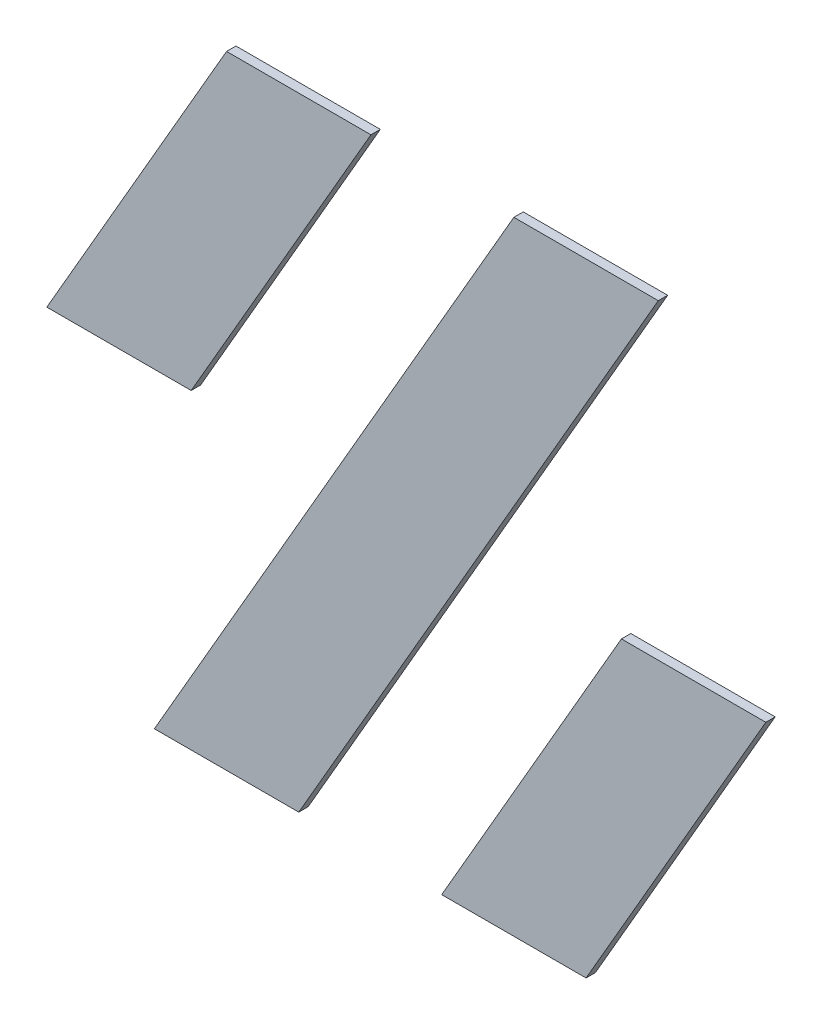
ISO-10303-21;
HEADER;
FILE_DESCRIPTION(('STEP AP214'),'2;1');
FILE_NAME('part.step','',(''),(''),'','','');
FILE_SCHEMA(('AUTOMOTIVE_DESIGN { 1 0 10303 214 1 1 1 1 }'));
ENDSEC;
DATA;
#1=APPLICATION_CONTEXT('core data for automotive mechanical design processes');
#2=APPLICATION_PROTOCOL_DEFINITION('international standard','automotive_design',2000,#1);
#3=PRODUCT_CONTEXT('',#1,'mechanical');
#4=PRODUCT('Part','Part','',(#3));
#5=PRODUCT_RELATED_PRODUCT_CATEGORY('part','',(#4));
#6=PRODUCT_DEFINITION_FORMATION('','',#4);
#7=PRODUCT_DEFINITION_CONTEXT('part definition',#1,'design');
#8=PRODUCT_DEFINITION('design','',#6,#7);
#9=PRODUCT_DEFINITION_SHAPE('','',#8);
#10=(LENGTH_UNIT() NAMED_UNIT(*) SI_UNIT(.MILLI.,.METRE.));
#11=(NAMED_UNIT(*) PLANE_ANGLE_UNIT() SI_UNIT($,.RADIAN.));
#12=(NAMED_UNIT(*) SI_UNIT($,.STERADIAN.) SOLID_ANGLE_UNIT());
#13=UNCERTAINTY_MEASURE_WITH_UNIT(LENGTH_MEASURE(1.E-05),#10,'distance_accuracy_value','');
#14=(GEOMETRIC_REPRESENTATION_CONTEXT(3) GLOBAL_UNCERTAINTY_ASSIGNED_CONTEXT((#13)) GLOBAL_UNIT_ASSIGNED_CONTEXT((#10,
#11,#12)) REPRESENTATION_CONTEXT('',''));
#15=CARTESIAN_POINT('',(0.,0.,0.));
#16=DIRECTION('',(0.,0.,1.));
#17=DIRECTION('',(1.,0.,0.));
#18=AXIS2_PLACEMENT_3D('',#15,#16,#17);
#19=CARTESIAN_POINT('',(-8.05858371450115,-9.95929214352105,-0.3));
#20=DIRECTION('',(-0.866025403784439,0.5,0.));
#21=DIRECTION('',(-0.5,-0.866025403784439,0.));
#22=AXIS2_PLACEMENT_3D('',#19,#20,#21);
#23=PLANE('',#22);
#24=DIRECTION('',(-0.5,-0.866025403784439,0.));
#25=VECTOR('',#24,1.);
#26=CARTESIAN_POINT('',(-8.05858371450115,-9.95929214352105,0.));
#27=LINE('',#26,#25);
#28=CARTESIAN_POINT('',(3.44141628549884,9.95929214352104,0.));
#29=VERTEX_POINT('',#28);
#30=CARTESIAN_POINT('',(-8.05858371450115,-9.95929214352105,0.));
#31=VERTEX_POINT('',#30);
#32=EDGE_CURVE('E108',#29,#31,#27,.T.);
#33=ORIENTED_EDGE('',*,*,#32,.F.);
#34=DIRECTION('',(0.,0.,1.));
#35=VECTOR('',#34,1.);
#36=CARTESIAN_POINT('',(3.44141628549884,9.95929214352104,-0.3));
#37=LINE('',#36,#35);
#38=CARTESIAN_POINT('',(3.44141628549884,9.95929214352104,-0.3));
#39=VERTEX_POINT('',#38);
#40=EDGE_CURVE('E12',#39,#29,#37,.T.);
#41=ORIENTED_EDGE('',*,*,#40,.F.);
#42=DIRECTION('',(-0.5,-0.866025403784439,0.));
#43=VECTOR('',#42,1.);
#44=CARTESIAN_POINT('',(-8.05858371450115,-9.95929214352105,-0.3));
#45=LINE('',#44,#43);
#46=CARTESIAN_POINT('',(-8.05858371450115,-9.95929214352105,-0.3));
#47=VERTEX_POINT('',#46);
#48=EDGE_CURVE('E102',#39,#47,#45,.T.);
#49=ORIENTED_EDGE('',*,*,#48,.T.);
#50=DIRECTION('',(0.,0.,1.));
#51=VECTOR('',#50,1.);
#52=CARTESIAN_POINT('',(-8.05858371450115,-9.95929214352105,-0.3));
#53=LINE('',#52,#51);
#54=EDGE_CURVE('E47',#47,#31,#53,.T.);
#55=ORIENTED_EDGE('',*,*,#54,.T.);
#56=EDGE_LOOP('',(#33,#41,#49,#55));
#57=FACE_BOUND('',#56,.T.);
#58=ADVANCED_FACE('F44',(#57),#23,.T.);
#59=CARTESIAN_POINT('',(3.44141628549884,9.95929214352104,-0.3));
#60=DIRECTION('',(0.,1.,0.));
#61=DIRECTION('',(0.,0.,1.));
#62=AXIS2_PLACEMENT_3D('',#59,#60,#61);
#63=PLANE('',#62);
#64=DIRECTION('',(-1.,0.,0.));
#65=VECTOR('',#64,1.);
#66=CARTESIAN_POINT('',(3.44141628549884,9.95929214352104,0.));
#67=LINE('',#66,#65);
#68=CARTESIAN_POINT('',(8.06021843901584,9.95929214352104,0.));
#69=VERTEX_POINT('',#68);
#70=EDGE_CURVE('E104',#69,#29,#67,.T.);
#71=ORIENTED_EDGE('',*,*,#70,.F.);
#72=DIRECTION('',(0.,0.,1.));
#73=VECTOR('',#72,1.);
#74=CARTESIAN_POINT('',(8.06021843901584,9.95929214352104,-0.3));
#75=LINE('',#74,#73);
#76=CARTESIAN_POINT('',(8.06021843901584,9.95929214352104,-0.3));
#77=VERTEX_POINT('',#76);
#78=EDGE_CURVE('E53',#77,#69,#75,.T.);
#79=ORIENTED_EDGE('',*,*,#78,.F.);
#80=DIRECTION('',(-1.,0.,0.));
#81=VECTOR('',#80,1.);
#82=CARTESIAN_POINT('',(3.44141628549884,9.95929214352104,-0.3));
#83=LINE('',#82,#81);
#84=EDGE_CURVE('E99',#77,#39,#83,.T.);
#85=ORIENTED_EDGE('',*,*,#84,.T.);
#86=ORIENTED_EDGE('',*,*,#40,.T.);
#87=EDGE_LOOP('',(#71,#79,#85,#86));
#88=FACE_BOUND('',#87,.T.);
#89=ADVANCED_FACE('F118',(#88),#63,.T.);
#90=CARTESIAN_POINT('',(8.06021843901584,9.95929214352104,-0.3));
#91=DIRECTION('',(0.866025403784439,-0.499999999999999,0.));
#92=DIRECTION('',(0.5,0.866025403784439,0.));
#93=AXIS2_PLACEMENT_3D('',#90,#91,#92);
#94=PLANE('',#93);
#95=DIRECTION('',(0.5,0.866025403784439,0.));
#96=VECTOR('',#95,1.);
#97=CARTESIAN_POINT('',(8.06021843901584,9.95929214352104,0.));
#98=LINE('',#97,#96);
#99=CARTESIAN_POINT('',(-3.43978156098414,-9.95929214352105,0.));
#100=VERTEX_POINT('',#99);
#101=EDGE_CURVE('E94',#100,#69,#98,.T.);
#102=ORIENTED_EDGE('',*,*,#101,.F.);
#103=DIRECTION('',(0.,0.,1.));
#104=VECTOR('',#103,1.);
#105=CARTESIAN_POINT('',(-3.43978156098414,-9.95929214352105,-0.3));
#106=LINE('',#105,#104);
#107=CARTESIAN_POINT('',(-3.43978156098414,-9.95929214352105,-0.3));
#108=VERTEX_POINT('',#107);
#109=EDGE_CURVE('E89',#108,#100,#106,.T.);
#110=ORIENTED_EDGE('',*,*,#109,.F.);
#111=DIRECTION('',(0.5,0.866025403784439,0.));
#112=VECTOR('',#111,1.);
#113=CARTESIAN_POINT('',(8.06021843901584,9.95929214352104,-0.3));
#114=LINE('',#113,#112);
#115=EDGE_CURVE('E92',#108,#77,#114,.T.);
#116=ORIENTED_EDGE('',*,*,#115,.T.);
#117=ORIENTED_EDGE('',*,*,#78,.T.);
#118=EDGE_LOOP('',(#102,#110,#116,#117));
#119=FACE_BOUND('',#118,.T.);
#120=ADVANCED_FACE('F91',(#119),#94,.T.);
#121=CARTESIAN_POINT('',(-3.43978156098414,-9.95929214352105,-0.3));
#122=DIRECTION('',(0.,-1.,0.));
#123=DIRECTION('',(1.,0.,0.));
#124=AXIS2_PLACEMENT_3D('',#121,#122,#123);
#125=PLANE('',#124);
#126=DIRECTION('',(1.,0.,0.));
#127=VECTOR('',#126,1.);
#128=CARTESIAN_POINT('',(-3.43978156098414,-9.95929214352105,0.));
#129=LINE('',#128,#127);
#130=EDGE_CURVE('E111',#31,#100,#129,.T.);
#131=ORIENTED_EDGE('',*,*,#130,.F.);
#132=ORIENTED_EDGE('',*,*,#54,.F.);
#133=DIRECTION('',(1.,0.,0.));
#134=VECTOR('',#133,1.);
#135=CARTESIAN_POINT('',(-3.43978156098414,-9.95929214352105,-0.3));
#136=LINE('',#135,#134);
#137=EDGE_CURVE('E98',#47,#108,#136,.T.);
#138=ORIENTED_EDGE('',*,*,#137,.T.);
#139=ORIENTED_EDGE('',*,*,#109,.T.);
#140=EDGE_LOOP('',(#131,#132,#138,#139));
#141=FACE_BOUND('',#140,.T.);
#142=ADVANCED_FACE('F101',(#141),#125,.T.);
#143=CARTESIAN_POINT('',(0.,0.,-0.3));
#144=DIRECTION('',(0.,0.,-1.));
#145=DIRECTION('',(-1.,0.,0.));
#146=AXIS2_PLACEMENT_3D('',#143,#144,#145);
#147=PLANE('',#146);
#148=ORIENTED_EDGE('',*,*,#48,.F.);
#149=ORIENTED_EDGE('',*,*,#84,.F.);
#150=ORIENTED_EDGE('',*,*,#115,.F.);
#151=ORIENTED_EDGE('',*,*,#137,.F.);
#152=EDGE_LOOP('',(#148,#149,#150,#151));
#153=FACE_BOUND('',#152,.T.);
#154=ADVANCED_FACE('F97',(#153),#147,.T.);
#155=CARTESIAN_POINT('',(0.,0.,0.));
#156=DIRECTION('',(0.,0.,-1.));
#157=DIRECTION('',(-1.,0.,0.));
#158=AXIS2_PLACEMENT_3D('',#155,#156,#157);
#159=PLANE('',#158);
#160=ORIENTED_EDGE('',*,*,#32,.T.);
#161=ORIENTED_EDGE('',*,*,#130,.T.);
#162=ORIENTED_EDGE('',*,*,#101,.T.);
#163=ORIENTED_EDGE('',*,*,#70,.T.);
#164=EDGE_LOOP('',(#160,#161,#162,#163));
#165=FACE_BOUND('',#164,.T.);
#166=ADVANCED_FACE('F117',(#165),#159,.F.);
#167=CLOSED_SHELL('',(#58,#89,#120,#142,#154,#166));
#168=MANIFOLD_SOLID_BREP('B2',#167);
#169=CARTESIAN_POINT('',(11.5,0.,-0.3));
#170=DIRECTION('',(0.,1.,0.));
#171=DIRECTION('',(-1.,0.,0.));
#172=AXIS2_PLACEMENT_3D('',#169,#170,#171);
#173=PLANE('',#172);
#174=DIRECTION('',(-1.,0.,0.));
#175=VECTOR('',#174,1.);
#176=CARTESIAN_POINT('',(11.5,0.,0.));
#177=LINE('',#176,#175);
#178=CARTESIAN_POINT('',(11.5,0.,0.));
#179=VERTEX_POINT('',#178);
#180=CARTESIAN_POINT('',(6.88119784648302,0.,0.));
#181=VERTEX_POINT('',#180);
#182=EDGE_CURVE('E241',#179,#181,#177,.T.);
#183=ORIENTED_EDGE('',*,*,#182,.F.);
#184=DIRECTION('',(0.,0.,1.));
#185=VECTOR('',#184,1.);
#186=CARTESIAN_POINT('',(11.5,0.,-0.3));
#187=LINE('',#186,#185);
#188=CARTESIAN_POINT('',(11.5,0.,-0.3));
#189=VERTEX_POINT('',#188);
#190=EDGE_CURVE('E42',#189,#179,#187,.T.);
#191=ORIENTED_EDGE('',*,*,#190,.F.);
#192=DIRECTION('',(-1.,0.,0.));
#193=VECTOR('',#192,1.);
#194=CARTESIAN_POINT('',(11.5,0.,-0.3));
#195=LINE('',#194,#193);
#196=CARTESIAN_POINT('',(6.88119784648302,0.,-0.3));
#197=VERTEX_POINT('',#196);
#198=EDGE_CURVE('E235',#189,#197,#195,.T.);
#199=ORIENTED_EDGE('',*,*,#198,.T.);
#200=DIRECTION('',(0.,0.,1.));
#201=VECTOR('',#200,1.);
#202=CARTESIAN_POINT('',(6.88119784648302,0.,-0.3));
#203=LINE('',#202,#201);
#204=EDGE_CURVE('E180',#197,#181,#203,.T.);
#205=ORIENTED_EDGE('',*,*,#204,.T.);
#206=EDGE_LOOP('',(#183,#191,#199,#205));
#207=FACE_BOUND('',#206,.T.);
#208=ADVANCED_FACE('F177',(#207),#173,.T.);
#209=CARTESIAN_POINT('',(5.75000000000012,-9.95929214352098,-0.3));
#210=DIRECTION('',(0.866025403784442,-0.499999999999995,0.));
#211=DIRECTION('',(0.499999999999995,0.866025403784442,0.));
#212=AXIS2_PLACEMENT_3D('',#209,#210,#211);
#213=PLANE('',#212);
#214=DIRECTION('',(0.499999999999995,0.866025403784442,0.));
#215=VECTOR('',#214,1.);
#216=CARTESIAN_POINT('',(5.75000000000012,-9.95929214352098,0.));
#217=LINE('',#216,#215);
#218=CARTESIAN_POINT('',(5.75000000000012,-9.95929214352098,0.));
#219=VERTEX_POINT('',#218);
#220=EDGE_CURVE('E237',#219,#179,#217,.T.);
#221=ORIENTED_EDGE('',*,*,#220,.F.);
#222=DIRECTION('',(0.,0.,1.));
#223=VECTOR('',#222,1.);
#224=CARTESIAN_POINT('',(5.75000000000012,-9.95929214352098,-0.3));
#225=LINE('',#224,#223);
#226=CARTESIAN_POINT('',(5.75000000000012,-9.95929214352098,-0.3));
#227=VERTEX_POINT('',#226);
#228=EDGE_CURVE('E186',#227,#219,#225,.T.);
#229=ORIENTED_EDGE('',*,*,#228,.F.);
#230=DIRECTION('',(0.499999999999995,0.866025403784442,0.));
#231=VECTOR('',#230,1.);
#232=CARTESIAN_POINT('',(5.75000000000012,-9.95929214352098,-0.3));
#233=LINE('',#232,#231);
#234=EDGE_CURVE('E232',#227,#189,#233,.T.);
#235=ORIENTED_EDGE('',*,*,#234,.T.);
#236=ORIENTED_EDGE('',*,*,#190,.T.);
#237=EDGE_LOOP('',(#221,#229,#235,#236));
#238=FACE_BOUND('',#237,.T.);
#239=ADVANCED_FACE('F251',(#238),#213,.T.);
#240=CARTESIAN_POINT('',(1.131197846483,-9.95929214352106,-0.3));
#241=DIRECTION('',(0.,-1.,0.));
#242=DIRECTION('',(1.,0.,0.));
#243=AXIS2_PLACEMENT_3D('',#240,#241,#242);
#244=PLANE('',#243);
#245=DIRECTION('',(1.,0.,0.));
#246=VECTOR('',#245,1.);
#247=CARTESIAN_POINT('',(1.131197846483,-9.95929214352106,0.));
#248=LINE('',#247,#246);
#249=CARTESIAN_POINT('',(1.131197846483,-9.95929214352106,0.));
#250=VERTEX_POINT('',#249);
#251=EDGE_CURVE('E227',#250,#219,#248,.T.);
#252=ORIENTED_EDGE('',*,*,#251,.F.);
#253=DIRECTION('',(0.,0.,1.));
#254=VECTOR('',#253,1.);
#255=CARTESIAN_POINT('',(1.131197846483,-9.95929214352106,-0.3));
#256=LINE('',#255,#254);
#257=CARTESIAN_POINT('',(1.131197846483,-9.95929214352106,-0.3));
#258=VERTEX_POINT('',#257);
#259=EDGE_CURVE('E222',#258,#250,#256,.T.);
#260=ORIENTED_EDGE('',*,*,#259,.F.);
#261=DIRECTION('',(1.,0.,0.));
#262=VECTOR('',#261,1.);
#263=CARTESIAN_POINT('',(1.131197846483,-9.95929214352106,-0.3));
#264=LINE('',#263,#262);
#265=EDGE_CURVE('E225',#258,#227,#264,.T.);
#266=ORIENTED_EDGE('',*,*,#265,.T.);
#267=ORIENTED_EDGE('',*,*,#228,.T.);
#268=EDGE_LOOP('',(#252,#260,#266,#267));
#269=FACE_BOUND('',#268,.T.);
#270=ADVANCED_FACE('F224',(#269),#244,.T.);
#271=CARTESIAN_POINT('',(6.88119784648302,0.,-0.3));
#272=DIRECTION('',(-0.866025403784439,0.5,0.));
#273=DIRECTION('',(-0.5,-0.866025403784439,0.));
#274=AXIS2_PLACEMENT_3D('',#271,#272,#273);
#275=PLANE('',#274);
#276=DIRECTION('',(-0.5,-0.866025403784439,0.));
#277=VECTOR('',#276,1.);
#278=CARTESIAN_POINT('',(6.88119784648302,0.,0.));
#279=LINE('',#278,#277);
#280=EDGE_CURVE('E244',#181,#250,#279,.T.);
#281=ORIENTED_EDGE('',*,*,#280,.F.);
#282=ORIENTED_EDGE('',*,*,#204,.F.);
#283=DIRECTION('',(-0.5,-0.866025403784439,0.));
#284=VECTOR('',#283,1.);
#285=CARTESIAN_POINT('',(6.88119784648302,0.,-0.3));
#286=LINE('',#285,#284);
#287=EDGE_CURVE('E231',#197,#258,#286,.T.);
#288=ORIENTED_EDGE('',*,*,#287,.T.);
#289=ORIENTED_EDGE('',*,*,#259,.T.);
#290=EDGE_LOOP('',(#281,#282,#288,#289));
#291=FACE_BOUND('',#290,.T.);
#292=ADVANCED_FACE('F234',(#291),#275,.T.);
#293=CARTESIAN_POINT('',(0.,0.,-0.3));
#294=DIRECTION('',(0.,0.,1.));
#295=DIRECTION('',(1.,0.,0.));
#296=AXIS2_PLACEMENT_3D('',#293,#294,#295);
#297=PLANE('',#296);
#298=ORIENTED_EDGE('',*,*,#198,.F.);
#299=ORIENTED_EDGE('',*,*,#234,.F.);
#300=ORIENTED_EDGE('',*,*,#265,.F.);
#301=ORIENTED_EDGE('',*,*,#287,.F.);
#302=EDGE_LOOP('',(#298,#299,#300,#301));
#303=FACE_BOUND('',#302,.T.);
#304=ADVANCED_FACE('F230',(#303),#297,.F.);
#305=CARTESIAN_POINT('',(0.,0.,0.));
#306=DIRECTION('',(0.,0.,1.));
#307=DIRECTION('',(1.,0.,0.));
#308=AXIS2_PLACEMENT_3D('',#305,#306,#307);
#309=PLANE('',#308);
#310=ORIENTED_EDGE('',*,*,#182,.T.);
#311=ORIENTED_EDGE('',*,*,#280,.T.);
#312=ORIENTED_EDGE('',*,*,#251,.T.);
#313=ORIENTED_EDGE('',*,*,#220,.T.);
#314=EDGE_LOOP('',(#310,#311,#312,#313));
#315=FACE_BOUND('',#314,.T.);
#316=ADVANCED_FACE('F250',(#315),#309,.T.);
#317=CLOSED_SHELL('',(#208,#239,#270,#292,#304,#316));
#318=MANIFOLD_SOLID_BREP('B6',#317);
#319=CARTESIAN_POINT('',(-5.75000000000005,9.95929214352102,-0.3));
#320=DIRECTION('',(0.,1.,0.));
#321=DIRECTION('',(-1.,0.,0.));
#322=AXIS2_PLACEMENT_3D('',#319,#320,#321);
#323=PLANE('',#322);
#324=DIRECTION('',(-1.,0.,0.));
#325=VECTOR('',#324,1.);
#326=CARTESIAN_POINT('',(-5.75000000000005,9.95929214352102,0.));
#327=LINE('',#326,#325);
#328=CARTESIAN_POINT('',(-1.131197846483,9.95929214352106,0.));
#329=VERTEX_POINT('',#328);
#330=CARTESIAN_POINT('',(-5.75000000000005,9.95929214352102,0.));
#331=VERTEX_POINT('',#330);
#332=EDGE_CURVE('E365',#329,#331,#327,.T.);
#333=ORIENTED_EDGE('',*,*,#332,.F.);
#334=DIRECTION('',(0.,0.,1.));
#335=VECTOR('',#334,1.);
#336=CARTESIAN_POINT('',(-1.131197846483,9.95929214352106,-0.3));
#337=LINE('',#336,#335);
#338=CARTESIAN_POINT('',(-1.131197846483,9.95929214352106,-0.3));
#339=VERTEX_POINT('',#338);
#340=EDGE_CURVE('E175',#339,#329,#337,.T.);
#341=ORIENTED_EDGE('',*,*,#340,.F.);
#342=DIRECTION('',(-1.,0.,0.));
#343=VECTOR('',#342,1.);
#344=CARTESIAN_POINT('',(-5.75000000000005,9.95929214352102,-0.3));
#345=LINE('',#344,#343);
#346=CARTESIAN_POINT('',(-5.75000000000005,9.95929214352102,-0.3));
#347=VERTEX_POINT('',#346);
#348=EDGE_CURVE('E359',#339,#347,#345,.T.);
#349=ORIENTED_EDGE('',*,*,#348,.T.);
#350=DIRECTION('',(0.,0.,1.));
#351=VECTOR('',#350,1.);
#352=CARTESIAN_POINT('',(-5.75000000000005,9.95929214352102,-0.3));
#353=LINE('',#352,#351);
#354=EDGE_CURVE('E304',#347,#331,#353,.T.);
#355=ORIENTED_EDGE('',*,*,#354,.T.);
#356=EDGE_LOOP('',(#333,#341,#349,#355));
#357=FACE_BOUND('',#356,.T.);
#358=ADVANCED_FACE('F301',(#357),#323,.T.);
#359=CARTESIAN_POINT('',(-1.131197846483,9.95929214352106,-0.3));
#360=DIRECTION('',(0.866025403784439,-0.5,0.));
#361=DIRECTION('',(0.5,0.866025403784439,0.));
#362=AXIS2_PLACEMENT_3D('',#359,#360,#361);
#363=PLANE('',#362);
#364=DIRECTION('',(0.5,0.866025403784439,0.));
#365=VECTOR('',#364,1.);
#366=CARTESIAN_POINT('',(-1.131197846483,9.95929214352106,0.));
#367=LINE('',#366,#365);
#368=CARTESIAN_POINT('',(-6.88119784648301,0.,0.));
#369=VERTEX_POINT('',#368);
#370=EDGE_CURVE('E361',#369,#329,#367,.T.);
#371=ORIENTED_EDGE('',*,*,#370,.F.);
#372=DIRECTION('',(0.,0.,1.));
#373=VECTOR('',#372,1.);
#374=CARTESIAN_POINT('',(-6.88119784648301,0.,-0.3));
#375=LINE('',#374,#373);
#376=CARTESIAN_POINT('',(-6.88119784648301,0.,-0.3));
#377=VERTEX_POINT('',#376);
#378=EDGE_CURVE('E310',#377,#369,#375,.T.);
#379=ORIENTED_EDGE('',*,*,#378,.F.);
#380=DIRECTION('',(0.5,0.866025403784439,0.));
#381=VECTOR('',#380,1.);
#382=CARTESIAN_POINT('',(-1.131197846483,9.95929214352106,-0.3));
#383=LINE('',#382,#381);
#384=EDGE_CURVE('E356',#377,#339,#383,.T.);
#385=ORIENTED_EDGE('',*,*,#384,.T.);
#386=ORIENTED_EDGE('',*,*,#340,.T.);
#387=EDGE_LOOP('',(#371,#379,#385,#386));
#388=FACE_BOUND('',#387,.T.);
#389=ADVANCED_FACE('F375',(#388),#363,.T.);
#390=CARTESIAN_POINT('',(-6.88119784648301,0.,-0.3));
#391=DIRECTION('',(0.,-1.,0.));
#392=DIRECTION('',(1.,0.,0.));
#393=AXIS2_PLACEMENT_3D('',#390,#391,#392);
#394=PLANE('',#393);
#395=DIRECTION('',(1.,0.,0.));
#396=VECTOR('',#395,1.);
#397=CARTESIAN_POINT('',(-6.88119784648301,0.,0.));
#398=LINE('',#397,#396);
#399=CARTESIAN_POINT('',(-11.5,0.,0.));
#400=VERTEX_POINT('',#399);
#401=EDGE_CURVE('E351',#400,#369,#398,.T.);
#402=ORIENTED_EDGE('',*,*,#401,.F.);
#403=DIRECTION('',(0.,0.,1.));
#404=VECTOR('',#403,1.);
#405=CARTESIAN_POINT('',(-11.5,0.,-0.3));
#406=LINE('',#405,#404);
#407=CARTESIAN_POINT('',(-11.5,0.,-0.3));
#408=VERTEX_POINT('',#407);
#409=EDGE_CURVE('E346',#408,#400,#406,.T.);
#410=ORIENTED_EDGE('',*,*,#409,.F.);
#411=DIRECTION('',(1.,0.,0.));
#412=VECTOR('',#411,1.);
#413=CARTESIAN_POINT('',(-6.88119784648301,0.,-0.3));
#414=LINE('',#413,#412);
#415=EDGE_CURVE('E349',#408,#377,#414,.T.);
#416=ORIENTED_EDGE('',*,*,#415,.T.);
#417=ORIENTED_EDGE('',*,*,#378,.T.);
#418=EDGE_LOOP('',(#402,#410,#416,#417));
#419=FACE_BOUND('',#418,.T.);
#420=ADVANCED_FACE('F348',(#419),#394,.T.);
#421=CARTESIAN_POINT('',(-5.75000000000005,9.95929214352102,-0.3));
#422=DIRECTION('',(-0.866025403784442,0.499999999999995,0.));
#423=DIRECTION('',(-0.499999999999995,-0.866025403784442,0.));
#424=AXIS2_PLACEMENT_3D('',#421,#422,#423);
#425=PLANE('',#424);
#426=DIRECTION('',(-0.499999999999995,-0.866025403784442,0.));
#427=VECTOR('',#426,1.);
#428=CARTESIAN_POINT('',(-5.75000000000005,9.95929214352102,0.));
#429=LINE('',#428,#427);
#430=EDGE_CURVE('E368',#331,#400,#429,.T.);
#431=ORIENTED_EDGE('',*,*,#430,.F.);
#432=ORIENTED_EDGE('',*,*,#354,.F.);
#433=DIRECTION('',(-0.499999999999995,-0.866025403784442,0.));
#434=VECTOR('',#433,1.);
#435=CARTESIAN_POINT('',(-5.75000000000005,9.95929214352102,-0.3));
#436=LINE('',#435,#434);
#437=EDGE_CURVE('E355',#347,#408,#436,.T.);
#438=ORIENTED_EDGE('',*,*,#437,.T.);
#439=ORIENTED_EDGE('',*,*,#409,.T.);
#440=EDGE_LOOP('',(#431,#432,#438,#439));
#441=FACE_BOUND('',#440,.T.);
#442=ADVANCED_FACE('F358',(#441),#425,.T.);
#443=CARTESIAN_POINT('',(0.,0.,-0.3));
#444=DIRECTION('',(0.,0.,-1.));
#445=DIRECTION('',(-1.,0.,0.));
#446=AXIS2_PLACEMENT_3D('',#443,#444,#445);
#447=PLANE('',#446);
#448=ORIENTED_EDGE('',*,*,#348,.F.);
#449=ORIENTED_EDGE('',*,*,#384,.F.);
#450=ORIENTED_EDGE('',*,*,#415,.F.);
#451=ORIENTED_EDGE('',*,*,#437,.F.);
#452=EDGE_LOOP('',(#448,#449,#450,#451));
#453=FACE_BOUND('',#452,.T.);
#454=ADVANCED_FACE('F354',(#453),#447,.T.);
#455=CARTESIAN_POINT('',(0.,0.,0.));
#456=DIRECTION('',(0.,0.,-1.));
#457=DIRECTION('',(-1.,0.,0.));
#458=AXIS2_PLACEMENT_3D('',#455,#456,#457);
#459=PLANE('',#458);
#460=ORIENTED_EDGE('',*,*,#332,.T.);
#461=ORIENTED_EDGE('',*,*,#430,.T.);
#462=ORIENTED_EDGE('',*,*,#401,.T.);
#463=ORIENTED_EDGE('',*,*,#370,.T.);
#464=EDGE_LOOP('',(#460,#461,#462,#463));
#465=FACE_BOUND('',#464,.T.);
#466=ADVANCED_FACE('F374',(#465),#459,.F.);
#467=CLOSED_SHELL('',(#358,#389,#420,#442,#454,#466));
#468=MANIFOLD_SOLID_BREP('B36',#467);
#469=ADVANCED_BREP_SHAPE_REPRESENTATION('',(#18,#168,#318,#468),#14);
#470=SHAPE_DEFINITION_REPRESENTATION(#9,#469);
ENDSEC;
END-ISO-10303-21;
